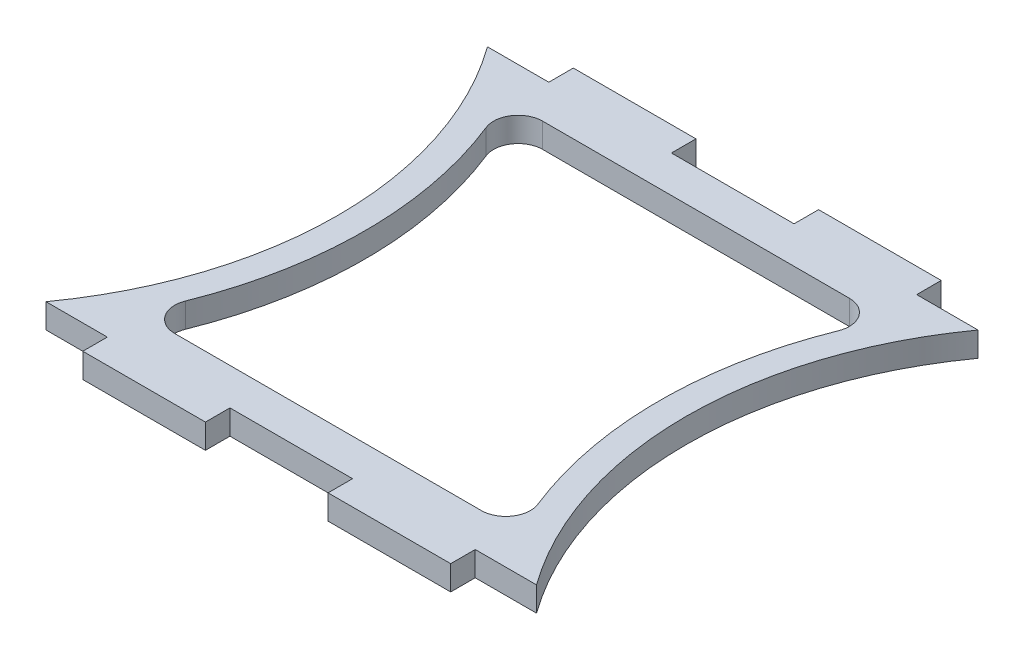
ISO-10303-21;
HEADER;
FILE_DESCRIPTION(('STEP AP214'),'2;1');
FILE_NAME('part.step','',(''),(''),'','','');
FILE_SCHEMA(('AUTOMOTIVE_DESIGN { 1 0 10303 214 1 1 1 1 }'));
ENDSEC;
DATA;
#1=APPLICATION_CONTEXT('core data for automotive mechanical design processes');
#2=APPLICATION_PROTOCOL_DEFINITION('international standard','automotive_design',2000,#1);
#3=PRODUCT_CONTEXT('',#1,'mechanical');
#4=PRODUCT('Part','Part','',(#3));
#5=PRODUCT_RELATED_PRODUCT_CATEGORY('part','',(#4));
#6=PRODUCT_DEFINITION_FORMATION('','',#4);
#7=PRODUCT_DEFINITION_CONTEXT('part definition',#1,'design');
#8=PRODUCT_DEFINITION('design','',#6,#7);
#9=PRODUCT_DEFINITION_SHAPE('','',#8);
#10=(LENGTH_UNIT() NAMED_UNIT(*) SI_UNIT(.MILLI.,.METRE.));
#11=(NAMED_UNIT(*) PLANE_ANGLE_UNIT() SI_UNIT($,.RADIAN.));
#12=(NAMED_UNIT(*) SI_UNIT($,.STERADIAN.) SOLID_ANGLE_UNIT());
#13=UNCERTAINTY_MEASURE_WITH_UNIT(LENGTH_MEASURE(1.E-05),#10,'distance_accuracy_value','');
#14=(GEOMETRIC_REPRESENTATION_CONTEXT(3) GLOBAL_UNCERTAINTY_ASSIGNED_CONTEXT((#13)) GLOBAL_UNIT_ASSIGNED_CONTEXT((#10,
#11,#12)) REPRESENTATION_CONTEXT('',''));
#15=CARTESIAN_POINT('',(0.,0.,0.));
#16=DIRECTION('',(0.,0.,1.));
#17=DIRECTION('',(1.,0.,0.));
#18=AXIS2_PLACEMENT_3D('',#15,#16,#17);
#19=CARTESIAN_POINT('',(45.,2.,0.));
#20=DIRECTION('',(0.,1.,0.));
#21=DIRECTION('',(0.,0.,1.));
#22=AXIS2_PLACEMENT_3D('',#19,#20,#21);
#23=PLANE('',#22);
#24=CARTESIAN_POINT('',(45.,2.,0.));
#25=DIRECTION('',(0.,-1.,0.));
#26=DIRECTION('',(0.,0.,1.));
#27=AXIS2_PLACEMENT_3D('',#24,#25,#26);
#28=CIRCLE('',#27,30.8058436014987);
#29=CARTESIAN_POINT('',(20.,2.,18.));
#30=VERTEX_POINT('',#29);
#31=CARTESIAN_POINT('',(20.,2.,-18.));
#32=VERTEX_POINT('',#31);
#33=EDGE_CURVE('E284',#30,#32,#28,.T.);
#34=ORIENTED_EDGE('',*,*,#33,.T.);
#35=DIRECTION('',(-1.,0.,0.));
#36=VECTOR('',#35,1.);
#37=CARTESIAN_POINT('',(15.,2.,-18.));
#38=LINE('',#37,#36);
#39=CARTESIAN_POINT('',(15.,2.,-18.));
#40=VERTEX_POINT('',#39);
#41=EDGE_CURVE('E287',#32,#40,#38,.T.);
#42=ORIENTED_EDGE('',*,*,#41,.T.);
#43=DIRECTION('',(0.,0.,-1.));
#44=VECTOR('',#43,1.);
#45=CARTESIAN_POINT('',(15.,2.,-18.));
#46=LINE('',#45,#44);
#47=CARTESIAN_POINT('',(15.,2.,-20.));
#48=VERTEX_POINT('',#47);
#49=EDGE_CURVE('E290',#40,#48,#46,.T.);
#50=ORIENTED_EDGE('',*,*,#49,.T.);
#51=DIRECTION('',(-1.,0.,0.));
#52=VECTOR('',#51,1.);
#53=CARTESIAN_POINT('',(15.,2.,-20.));
#54=LINE('',#53,#52);
#55=CARTESIAN_POINT('',(5.,2.,-20.));
#56=VERTEX_POINT('',#55);
#57=EDGE_CURVE('E292',#48,#56,#54,.T.);
#58=ORIENTED_EDGE('',*,*,#57,.T.);
#59=DIRECTION('',(0.,0.,1.));
#60=VECTOR('',#59,1.);
#61=CARTESIAN_POINT('',(5.,2.,-20.));
#62=LINE('',#61,#60);
#63=CARTESIAN_POINT('',(5.,2.,-18.));
#64=VERTEX_POINT('',#63);
#65=EDGE_CURVE('E294',#56,#64,#62,.T.);
#66=ORIENTED_EDGE('',*,*,#65,.T.);
#67=DIRECTION('',(-1.,0.,0.));
#68=VECTOR('',#67,1.);
#69=CARTESIAN_POINT('',(-5.,2.,-18.));
#70=LINE('',#69,#68);
#71=CARTESIAN_POINT('',(-5.,2.,-18.));
#72=VERTEX_POINT('',#71);
#73=EDGE_CURVE('E296',#64,#72,#70,.T.);
#74=ORIENTED_EDGE('',*,*,#73,.T.);
#75=DIRECTION('',(0.,0.,-1.));
#76=VECTOR('',#75,1.);
#77=CARTESIAN_POINT('',(-5.,2.,-20.));
#78=LINE('',#77,#76);
#79=CARTESIAN_POINT('',(-5.,2.,-20.));
#80=VERTEX_POINT('',#79);
#81=EDGE_CURVE('E298',#72,#80,#78,.T.);
#82=ORIENTED_EDGE('',*,*,#81,.T.);
#83=DIRECTION('',(-1.,0.,0.));
#84=VECTOR('',#83,1.);
#85=CARTESIAN_POINT('',(-15.,2.,-20.));
#86=LINE('',#85,#84);
#87=CARTESIAN_POINT('',(-15.,2.,-20.));
#88=VERTEX_POINT('',#87);
#89=EDGE_CURVE('E300',#80,#88,#86,.T.);
#90=ORIENTED_EDGE('',*,*,#89,.T.);
#91=DIRECTION('',(0.,0.,1.));
#92=VECTOR('',#91,1.);
#93=CARTESIAN_POINT('',(-15.,2.,-18.));
#94=LINE('',#93,#92);
#95=CARTESIAN_POINT('',(-15.,2.,-18.));
#96=VERTEX_POINT('',#95);
#97=EDGE_CURVE('E302',#88,#96,#94,.T.);
#98=ORIENTED_EDGE('',*,*,#97,.T.);
#99=DIRECTION('',(-1.,0.,0.));
#100=VECTOR('',#99,1.);
#101=CARTESIAN_POINT('',(-20.,2.,-18.));
#102=LINE('',#101,#100);
#103=CARTESIAN_POINT('',(-20.,2.,-18.));
#104=VERTEX_POINT('',#103);
#105=EDGE_CURVE('E304',#96,#104,#102,.T.);
#106=ORIENTED_EDGE('',*,*,#105,.T.);
#107=CARTESIAN_POINT('',(-45.,2.,0.));
#108=DIRECTION('',(0.,-1.,0.));
#109=DIRECTION('',(0.,0.,-1.));
#110=AXIS2_PLACEMENT_3D('',#107,#108,#109);
#111=CIRCLE('',#110,30.8058436014987);
#112=CARTESIAN_POINT('',(-20.,2.,18.));
#113=VERTEX_POINT('',#112);
#114=EDGE_CURVE('E306',#104,#113,#111,.T.);
#115=ORIENTED_EDGE('',*,*,#114,.T.);
#116=DIRECTION('',(1.,0.,0.));
#117=VECTOR('',#116,1.);
#118=CARTESIAN_POINT('',(-20.,2.,18.));
#119=LINE('',#118,#117);
#120=CARTESIAN_POINT('',(-15.,2.,18.));
#121=VERTEX_POINT('',#120);
#122=EDGE_CURVE('E308',#113,#121,#119,.T.);
#123=ORIENTED_EDGE('',*,*,#122,.T.);
#124=DIRECTION('',(0.,0.,1.));
#125=VECTOR('',#124,1.);
#126=CARTESIAN_POINT('',(-15.,2.,18.));
#127=LINE('',#126,#125);
#128=CARTESIAN_POINT('',(-15.,2.,20.));
#129=VERTEX_POINT('',#128);
#130=EDGE_CURVE('E310',#121,#129,#127,.T.);
#131=ORIENTED_EDGE('',*,*,#130,.T.);
#132=DIRECTION('',(1.,0.,0.));
#133=VECTOR('',#132,1.);
#134=CARTESIAN_POINT('',(-15.,2.,20.));
#135=LINE('',#134,#133);
#136=CARTESIAN_POINT('',(-5.,2.,20.));
#137=VERTEX_POINT('',#136);
#138=EDGE_CURVE('E312',#129,#137,#135,.T.);
#139=ORIENTED_EDGE('',*,*,#138,.T.);
#140=DIRECTION('',(0.,0.,-1.));
#141=VECTOR('',#140,1.);
#142=CARTESIAN_POINT('',(-5.,2.,20.));
#143=LINE('',#142,#141);
#144=CARTESIAN_POINT('',(-5.,2.,18.));
#145=VERTEX_POINT('',#144);
#146=EDGE_CURVE('E314',#137,#145,#143,.T.);
#147=ORIENTED_EDGE('',*,*,#146,.T.);
#148=DIRECTION('',(1.,0.,0.));
#149=VECTOR('',#148,1.);
#150=CARTESIAN_POINT('',(-5.,2.,18.));
#151=LINE('',#150,#149);
#152=CARTESIAN_POINT('',(5.,2.,18.));
#153=VERTEX_POINT('',#152);
#154=EDGE_CURVE('E316',#145,#153,#151,.T.);
#155=ORIENTED_EDGE('',*,*,#154,.T.);
#156=DIRECTION('',(0.,0.,1.));
#157=VECTOR('',#156,1.);
#158=CARTESIAN_POINT('',(5.,2.,20.));
#159=LINE('',#158,#157);
#160=CARTESIAN_POINT('',(5.,2.,20.));
#161=VERTEX_POINT('',#160);
#162=EDGE_CURVE('E318',#153,#161,#159,.T.);
#163=ORIENTED_EDGE('',*,*,#162,.T.);
#164=DIRECTION('',(1.,0.,0.));
#165=VECTOR('',#164,1.);
#166=CARTESIAN_POINT('',(15.,2.,20.));
#167=LINE('',#166,#165);
#168=CARTESIAN_POINT('',(15.,2.,20.));
#169=VERTEX_POINT('',#168);
#170=EDGE_CURVE('E320',#161,#169,#167,.T.);
#171=ORIENTED_EDGE('',*,*,#170,.T.);
#172=DIRECTION('',(0.,0.,-1.));
#173=VECTOR('',#172,1.);
#174=CARTESIAN_POINT('',(15.,2.,18.));
#175=LINE('',#174,#173);
#176=CARTESIAN_POINT('',(15.,2.,18.));
#177=VERTEX_POINT('',#176);
#178=EDGE_CURVE('E322',#169,#177,#175,.T.);
#179=ORIENTED_EDGE('',*,*,#178,.T.);
#180=DIRECTION('',(1.,0.,0.));
#181=VECTOR('',#180,1.);
#182=CARTESIAN_POINT('',(15.,2.,18.));
#183=LINE('',#182,#181);
#184=EDGE_CURVE('E324',#177,#30,#183,.T.);
#185=ORIENTED_EDGE('',*,*,#184,.T.);
#186=EDGE_LOOP('',(#34,#42,#50,#58,#66,#74,#82,#90,#98,#106,#115,#123,#131,#139,#147,#155,#163,
#171,#179,#185));
#187=FACE_BOUND('',#186,.T.);
#188=DIRECTION('',(1.,0.,0.));
#189=VECTOR('',#188,1.);
#190=CARTESIAN_POINT('',(-12.5038463814561,2.,15.));
#191=LINE('',#190,#189);
#192=CARTESIAN_POINT('',(-12.5038463814561,2.,15.));
#193=VERTEX_POINT('',#192);
#194=CARTESIAN_POINT('',(12.5038463814561,2.,15.));
#195=VERTEX_POINT('',#194);
#196=EDGE_CURVE('E227',#193,#195,#191,.T.);
#197=ORIENTED_EDGE('',*,*,#196,.F.);
#198=CARTESIAN_POINT('',(-12.5038463814561,2.,13.));
#199=DIRECTION('',(0.,1.,0.));
#200=DIRECTION('',(0.,0.,-1.));
#201=AXIS2_PLACEMENT_3D('',#198,#199,#200);
#202=CIRCLE('',#201,2.);
#203=CARTESIAN_POINT('',(-14.3607694453729,2.,12.2571428571429));
#204=VERTEX_POINT('',#203);
#205=EDGE_CURVE('E219',#204,#193,#202,.T.);
#206=ORIENTED_EDGE('',*,*,#205,.F.);
#207=CARTESIAN_POINT('',(-45.,2.,0.));
#208=DIRECTION('',(0.,-1.,0.));
#209=DIRECTION('',(0.,0.,-1.));
#210=AXIS2_PLACEMENT_3D('',#207,#208,#209);
#211=CIRCLE('',#210,33.);
#212=CARTESIAN_POINT('',(-14.3607694453729,2.,-12.2571428571429));
#213=VERTEX_POINT('',#212);
#214=EDGE_CURVE('E252',#213,#204,#211,.T.);
#215=ORIENTED_EDGE('',*,*,#214,.F.);
#216=CARTESIAN_POINT('',(-12.5038463814562,2.,-13.));
#217=DIRECTION('',(0.,1.,0.));
#218=DIRECTION('',(0.,0.,-1.));
#219=AXIS2_PLACEMENT_3D('',#216,#217,#218);
#220=CIRCLE('',#219,2.);
#221=CARTESIAN_POINT('',(-12.5038463814562,2.,-15.));
#222=VERTEX_POINT('',#221);
#223=EDGE_CURVE('E250',#222,#213,#220,.T.);
#224=ORIENTED_EDGE('',*,*,#223,.F.);
#225=DIRECTION('',(-1.,0.,0.));
#226=VECTOR('',#225,1.);
#227=CARTESIAN_POINT('',(-12.5038463814562,2.,-15.));
#228=LINE('',#227,#226);
#229=CARTESIAN_POINT('',(12.5038463814562,2.,-15.));
#230=VERTEX_POINT('',#229);
#231=EDGE_CURVE('E248',#230,#222,#228,.T.);
#232=ORIENTED_EDGE('',*,*,#231,.F.);
#233=CARTESIAN_POINT('',(12.5038463814562,2.,-13.));
#234=DIRECTION('',(0.,1.,0.));
#235=DIRECTION('',(0.,0.,-1.));
#236=AXIS2_PLACEMENT_3D('',#233,#234,#235);
#237=CIRCLE('',#236,2.);
#238=CARTESIAN_POINT('',(14.3607694453729,2.,-12.2571428571429));
#239=VERTEX_POINT('',#238);
#240=EDGE_CURVE('E246',#239,#230,#237,.T.);
#241=ORIENTED_EDGE('',*,*,#240,.F.);
#242=CARTESIAN_POINT('',(45.,2.,0.));
#243=DIRECTION('',(0.,-1.,0.));
#244=DIRECTION('',(0.,0.,1.));
#245=AXIS2_PLACEMENT_3D('',#242,#243,#244);
#246=CIRCLE('',#245,33.);
#247=CARTESIAN_POINT('',(14.3607694453729,2.,12.2571428571429));
#248=VERTEX_POINT('',#247);
#249=EDGE_CURVE('E242',#248,#239,#246,.T.);
#250=ORIENTED_EDGE('',*,*,#249,.F.);
#251=CARTESIAN_POINT('',(12.5038463814561,2.,13.));
#252=DIRECTION('',(0.,1.,0.));
#253=DIRECTION('',(0.,0.,-1.));
#254=AXIS2_PLACEMENT_3D('',#251,#252,#253);
#255=CIRCLE('',#254,2.);
#256=EDGE_CURVE('E240',#195,#248,#255,.T.);
#257=ORIENTED_EDGE('',*,*,#256,.F.);
#258=EDGE_LOOP('',(#197,#206,#215,#224,#232,#241,#250,#257));
#259=FACE_BOUND('',#258,.T.);
#260=ADVANCED_FACE('F34',(#187,#259),#23,.T.);
#261=CARTESIAN_POINT('',(45.,0.,0.));
#262=DIRECTION('',(0.,1.,0.));
#263=DIRECTION('',(0.,0.,1.));
#264=AXIS2_PLACEMENT_3D('',#261,#262,#263);
#265=PLANE('',#264);
#266=CARTESIAN_POINT('',(45.,0.,0.));
#267=DIRECTION('',(0.,-1.,0.));
#268=DIRECTION('',(0.,0.,1.));
#269=AXIS2_PLACEMENT_3D('',#266,#267,#268);
#270=CIRCLE('',#269,30.8058436014987);
#271=CARTESIAN_POINT('',(20.,0.,18.));
#272=VERTEX_POINT('',#271);
#273=CARTESIAN_POINT('',(20.,0.,-18.));
#274=VERTEX_POINT('',#273);
#275=EDGE_CURVE('E235',#272,#274,#270,.T.);
#276=ORIENTED_EDGE('',*,*,#275,.F.);
#277=DIRECTION('',(1.,0.,0.));
#278=VECTOR('',#277,1.);
#279=CARTESIAN_POINT('',(15.,0.,18.));
#280=LINE('',#279,#278);
#281=CARTESIAN_POINT('',(15.,0.,18.));
#282=VERTEX_POINT('',#281);
#283=EDGE_CURVE('E288',#282,#272,#280,.T.);
#284=ORIENTED_EDGE('',*,*,#283,.F.);
#285=DIRECTION('',(0.,0.,-1.));
#286=VECTOR('',#285,1.);
#287=CARTESIAN_POINT('',(15.,0.,18.));
#288=LINE('',#287,#286);
#289=CARTESIAN_POINT('',(15.,0.,20.));
#290=VERTEX_POINT('',#289);
#291=EDGE_CURVE('E363',#290,#282,#288,.T.);
#292=ORIENTED_EDGE('',*,*,#291,.F.);
#293=DIRECTION('',(1.,0.,0.));
#294=VECTOR('',#293,1.);
#295=CARTESIAN_POINT('',(15.,0.,20.));
#296=LINE('',#295,#294);
#297=CARTESIAN_POINT('',(5.,0.,20.));
#298=VERTEX_POINT('',#297);
#299=EDGE_CURVE('E361',#298,#290,#296,.T.);
#300=ORIENTED_EDGE('',*,*,#299,.F.);
#301=DIRECTION('',(0.,0.,1.));
#302=VECTOR('',#301,1.);
#303=CARTESIAN_POINT('',(5.,0.,20.));
#304=LINE('',#303,#302);
#305=CARTESIAN_POINT('',(5.,0.,18.));
#306=VERTEX_POINT('',#305);
#307=EDGE_CURVE('E359',#306,#298,#304,.T.);
#308=ORIENTED_EDGE('',*,*,#307,.F.);
#309=DIRECTION('',(1.,0.,0.));
#310=VECTOR('',#309,1.);
#311=CARTESIAN_POINT('',(-5.,0.,18.));
#312=LINE('',#311,#310);
#313=CARTESIAN_POINT('',(-5.,0.,18.));
#314=VERTEX_POINT('',#313);
#315=EDGE_CURVE('E357',#314,#306,#312,.T.);
#316=ORIENTED_EDGE('',*,*,#315,.F.);
#317=DIRECTION('',(0.,0.,-1.));
#318=VECTOR('',#317,1.);
#319=CARTESIAN_POINT('',(-5.,0.,20.));
#320=LINE('',#319,#318);
#321=CARTESIAN_POINT('',(-5.,0.,20.));
#322=VERTEX_POINT('',#321);
#323=EDGE_CURVE('E355',#322,#314,#320,.T.);
#324=ORIENTED_EDGE('',*,*,#323,.F.);
#325=DIRECTION('',(1.,0.,0.));
#326=VECTOR('',#325,1.);
#327=CARTESIAN_POINT('',(-15.,0.,20.));
#328=LINE('',#327,#326);
#329=CARTESIAN_POINT('',(-15.,0.,20.));
#330=VERTEX_POINT('',#329);
#331=EDGE_CURVE('E353',#330,#322,#328,.T.);
#332=ORIENTED_EDGE('',*,*,#331,.F.);
#333=DIRECTION('',(0.,0.,1.));
#334=VECTOR('',#333,1.);
#335=CARTESIAN_POINT('',(-15.,0.,18.));
#336=LINE('',#335,#334);
#337=CARTESIAN_POINT('',(-15.,0.,18.));
#338=VERTEX_POINT('',#337);
#339=EDGE_CURVE('E351',#338,#330,#336,.T.);
#340=ORIENTED_EDGE('',*,*,#339,.F.);
#341=DIRECTION('',(1.,0.,0.));
#342=VECTOR('',#341,1.);
#343=CARTESIAN_POINT('',(-20.,0.,18.));
#344=LINE('',#343,#342);
#345=CARTESIAN_POINT('',(-20.,0.,18.));
#346=VERTEX_POINT('',#345);
#347=EDGE_CURVE('E349',#346,#338,#344,.T.);
#348=ORIENTED_EDGE('',*,*,#347,.F.);
#349=CARTESIAN_POINT('',(-45.,0.,0.));
#350=DIRECTION('',(0.,-1.,0.));
#351=DIRECTION('',(0.,0.,-1.));
#352=AXIS2_PLACEMENT_3D('',#349,#350,#351);
#353=CIRCLE('',#352,30.8058436014987);
#354=CARTESIAN_POINT('',(-20.,0.,-18.));
#355=VERTEX_POINT('',#354);
#356=EDGE_CURVE('E347',#355,#346,#353,.T.);
#357=ORIENTED_EDGE('',*,*,#356,.F.);
#358=DIRECTION('',(-1.,0.,0.));
#359=VECTOR('',#358,1.);
#360=CARTESIAN_POINT('',(-20.,0.,-18.));
#361=LINE('',#360,#359);
#362=CARTESIAN_POINT('',(-15.,0.,-18.));
#363=VERTEX_POINT('',#362);
#364=EDGE_CURVE('E345',#363,#355,#361,.T.);
#365=ORIENTED_EDGE('',*,*,#364,.F.);
#366=DIRECTION('',(0.,0.,1.));
#367=VECTOR('',#366,1.);
#368=CARTESIAN_POINT('',(-15.,0.,-18.));
#369=LINE('',#368,#367);
#370=CARTESIAN_POINT('',(-15.,0.,-20.));
#371=VERTEX_POINT('',#370);
#372=EDGE_CURVE('E343',#371,#363,#369,.T.);
#373=ORIENTED_EDGE('',*,*,#372,.F.);
#374=DIRECTION('',(-1.,0.,0.));
#375=VECTOR('',#374,1.);
#376=CARTESIAN_POINT('',(-15.,0.,-20.));
#377=LINE('',#376,#375);
#378=CARTESIAN_POINT('',(-5.,0.,-20.));
#379=VERTEX_POINT('',#378);
#380=EDGE_CURVE('E341',#379,#371,#377,.T.);
#381=ORIENTED_EDGE('',*,*,#380,.F.);
#382=DIRECTION('',(0.,0.,-1.));
#383=VECTOR('',#382,1.);
#384=CARTESIAN_POINT('',(-5.,0.,-20.));
#385=LINE('',#384,#383);
#386=CARTESIAN_POINT('',(-5.,0.,-18.));
#387=VERTEX_POINT('',#386);
#388=EDGE_CURVE('E339',#387,#379,#385,.T.);
#389=ORIENTED_EDGE('',*,*,#388,.F.);
#390=DIRECTION('',(-1.,0.,0.));
#391=VECTOR('',#390,1.);
#392=CARTESIAN_POINT('',(-5.,0.,-18.));
#393=LINE('',#392,#391);
#394=CARTESIAN_POINT('',(5.,0.,-18.));
#395=VERTEX_POINT('',#394);
#396=EDGE_CURVE('E337',#395,#387,#393,.T.);
#397=ORIENTED_EDGE('',*,*,#396,.F.);
#398=DIRECTION('',(0.,0.,1.));
#399=VECTOR('',#398,1.);
#400=CARTESIAN_POINT('',(5.,0.,-20.));
#401=LINE('',#400,#399);
#402=CARTESIAN_POINT('',(5.,0.,-20.));
#403=VERTEX_POINT('',#402);
#404=EDGE_CURVE('E335',#403,#395,#401,.T.);
#405=ORIENTED_EDGE('',*,*,#404,.F.);
#406=DIRECTION('',(-1.,0.,0.));
#407=VECTOR('',#406,1.);
#408=CARTESIAN_POINT('',(15.,0.,-20.));
#409=LINE('',#408,#407);
#410=CARTESIAN_POINT('',(15.,0.,-20.));
#411=VERTEX_POINT('',#410);
#412=EDGE_CURVE('E333',#411,#403,#409,.T.);
#413=ORIENTED_EDGE('',*,*,#412,.F.);
#414=DIRECTION('',(0.,0.,-1.));
#415=VECTOR('',#414,1.);
#416=CARTESIAN_POINT('',(15.,0.,-18.));
#417=LINE('',#416,#415);
#418=CARTESIAN_POINT('',(15.,0.,-18.));
#419=VERTEX_POINT('',#418);
#420=EDGE_CURVE('E331',#419,#411,#417,.T.);
#421=ORIENTED_EDGE('',*,*,#420,.F.);
#422=DIRECTION('',(-1.,0.,0.));
#423=VECTOR('',#422,1.);
#424=CARTESIAN_POINT('',(15.,0.,-18.));
#425=LINE('',#424,#423);
#426=EDGE_CURVE('E329',#274,#419,#425,.T.);
#427=ORIENTED_EDGE('',*,*,#426,.F.);
#428=EDGE_LOOP('',(#276,#284,#292,#300,#308,#316,#324,#332,#340,#348,#357,#365,#373,#381,#389,
#397,#405,#413,#421,#427));
#429=FACE_BOUND('',#428,.T.);
#430=CARTESIAN_POINT('',(-12.5038463814561,0.,13.));
#431=DIRECTION('',(0.,1.,0.));
#432=DIRECTION('',(0.,0.,-1.));
#433=AXIS2_PLACEMENT_3D('',#430,#431,#432);
#434=CIRCLE('',#433,2.);
#435=CARTESIAN_POINT('',(-14.3607694453729,0.,12.2571428571429));
#436=VERTEX_POINT('',#435);
#437=CARTESIAN_POINT('',(-12.5038463814561,0.,15.));
#438=VERTEX_POINT('',#437);
#439=EDGE_CURVE('E57',#436,#438,#434,.T.);
#440=ORIENTED_EDGE('',*,*,#439,.T.);
#441=DIRECTION('',(1.,0.,0.));
#442=VECTOR('',#441,1.);
#443=CARTESIAN_POINT('',(-12.5038463814561,0.,15.));
#444=LINE('',#443,#442);
#445=CARTESIAN_POINT('',(12.5038463814561,0.,15.));
#446=VERTEX_POINT('',#445);
#447=EDGE_CURVE('E234',#438,#446,#444,.T.);
#448=ORIENTED_EDGE('',*,*,#447,.T.);
#449=CARTESIAN_POINT('',(12.5038463814561,0.,13.));
#450=DIRECTION('',(0.,1.,0.));
#451=DIRECTION('',(0.,0.,-1.));
#452=AXIS2_PLACEMENT_3D('',#449,#450,#451);
#453=CIRCLE('',#452,2.);
#454=CARTESIAN_POINT('',(14.3607694453729,0.,12.2571428571429));
#455=VERTEX_POINT('',#454);
#456=EDGE_CURVE('E256',#446,#455,#453,.T.);
#457=ORIENTED_EDGE('',*,*,#456,.T.);
#458=CARTESIAN_POINT('',(45.,0.,0.));
#459=DIRECTION('',(0.,-1.,0.));
#460=DIRECTION('',(0.,0.,1.));
#461=AXIS2_PLACEMENT_3D('',#458,#459,#460);
#462=CIRCLE('',#461,33.);
#463=CARTESIAN_POINT('',(14.3607694453729,0.,-12.2571428571429));
#464=VERTEX_POINT('',#463);
#465=EDGE_CURVE('E259',#455,#464,#462,.T.);
#466=ORIENTED_EDGE('',*,*,#465,.T.);
#467=CARTESIAN_POINT('',(12.5038463814562,0.,-13.));
#468=DIRECTION('',(0.,1.,0.));
#469=DIRECTION('',(0.,0.,-1.));
#470=AXIS2_PLACEMENT_3D('',#467,#468,#469);
#471=CIRCLE('',#470,2.);
#472=CARTESIAN_POINT('',(12.5038463814562,0.,-15.));
#473=VERTEX_POINT('',#472);
#474=EDGE_CURVE('E262',#464,#473,#471,.T.);
#475=ORIENTED_EDGE('',*,*,#474,.T.);
#476=DIRECTION('',(-1.,0.,0.));
#477=VECTOR('',#476,1.);
#478=CARTESIAN_POINT('',(-12.5038463814562,0.,-15.));
#479=LINE('',#478,#477);
#480=CARTESIAN_POINT('',(-12.5038463814562,0.,-15.));
#481=VERTEX_POINT('',#480);
#482=EDGE_CURVE('E265',#473,#481,#479,.T.);
#483=ORIENTED_EDGE('',*,*,#482,.T.);
#484=CARTESIAN_POINT('',(-12.5038463814562,0.,-13.));
#485=DIRECTION('',(0.,1.,0.));
#486=DIRECTION('',(0.,0.,-1.));
#487=AXIS2_PLACEMENT_3D('',#484,#485,#486);
#488=CIRCLE('',#487,2.);
#489=CARTESIAN_POINT('',(-14.3607694453729,0.,-12.2571428571429));
#490=VERTEX_POINT('',#489);
#491=EDGE_CURVE('E268',#481,#490,#488,.T.);
#492=ORIENTED_EDGE('',*,*,#491,.T.);
#493=CARTESIAN_POINT('',(-45.,0.,0.));
#494=DIRECTION('',(0.,-1.,0.));
#495=DIRECTION('',(0.,0.,-1.));
#496=AXIS2_PLACEMENT_3D('',#493,#494,#495);
#497=CIRCLE('',#496,33.);
#498=EDGE_CURVE('E228',#490,#436,#497,.T.);
#499=ORIENTED_EDGE('',*,*,#498,.T.);
#500=EDGE_LOOP('',(#440,#448,#457,#466,#475,#483,#492,#499));
#501=FACE_BOUND('',#500,.T.);
#502=ADVANCED_FACE('F429',(#429,#501),#265,.F.);
#503=CARTESIAN_POINT('',(45.,2.,0.));
#504=DIRECTION('',(0.,-1.,0.));
#505=DIRECTION('',(0.,0.,-1.));
#506=AXIS2_PLACEMENT_3D('',#503,#504,#505);
#507=CYLINDRICAL_SURFACE('',#506,30.8058436014987);
#508=ORIENTED_EDGE('',*,*,#275,.T.);
#509=DIRECTION('',(0.,-1.,0.));
#510=VECTOR('',#509,1.);
#511=CARTESIAN_POINT('',(20.,2.,-18.));
#512=LINE('',#511,#510);
#513=EDGE_CURVE('E11',#32,#274,#512,.T.);
#514=ORIENTED_EDGE('',*,*,#513,.F.);
#515=ORIENTED_EDGE('',*,*,#33,.F.);
#516=DIRECTION('',(0.,-1.,0.));
#517=VECTOR('',#516,1.);
#518=CARTESIAN_POINT('',(20.,2.,18.));
#519=LINE('',#518,#517);
#520=EDGE_CURVE('E326',#30,#272,#519,.T.);
#521=ORIENTED_EDGE('',*,*,#520,.T.);
#522=EDGE_LOOP('',(#508,#514,#515,#521));
#523=FACE_BOUND('',#522,.T.);
#524=ADVANCED_FACE('F36',(#523),#507,.F.);
#525=CARTESIAN_POINT('',(15.,2.,-18.));
#526=DIRECTION('',(0.,0.,1.));
#527=DIRECTION('',(1.,0.,0.));
#528=AXIS2_PLACEMENT_3D('',#525,#526,#527);
#529=PLANE('',#528);
#530=ORIENTED_EDGE('',*,*,#426,.T.);
#531=DIRECTION('',(0.,-1.,0.));
#532=VECTOR('',#531,1.);
#533=CARTESIAN_POINT('',(15.,2.,-18.));
#534=LINE('',#533,#532);
#535=EDGE_CURVE('E42',#40,#419,#534,.T.);
#536=ORIENTED_EDGE('',*,*,#535,.F.);
#537=ORIENTED_EDGE('',*,*,#41,.F.);
#538=ORIENTED_EDGE('',*,*,#513,.T.);
#539=EDGE_LOOP('',(#530,#536,#537,#538));
#540=FACE_BOUND('',#539,.T.);
#541=ADVANCED_FACE('F446',(#540),#529,.F.);
#542=CARTESIAN_POINT('',(15.,2.,-18.));
#543=DIRECTION('',(-1.,0.,0.));
#544=DIRECTION('',(0.,0.,1.));
#545=AXIS2_PLACEMENT_3D('',#542,#543,#544);
#546=PLANE('',#545);
#547=ORIENTED_EDGE('',*,*,#420,.T.);
#548=DIRECTION('',(0.,-1.,0.));
#549=VECTOR('',#548,1.);
#550=CARTESIAN_POINT('',(15.,2.,-20.));
#551=LINE('',#550,#549);
#552=EDGE_CURVE('E416',#48,#411,#551,.T.);
#553=ORIENTED_EDGE('',*,*,#552,.F.);
#554=ORIENTED_EDGE('',*,*,#49,.F.);
#555=ORIENTED_EDGE('',*,*,#535,.T.);
#556=EDGE_LOOP('',(#547,#553,#554,#555));
#557=FACE_BOUND('',#556,.T.);
#558=ADVANCED_FACE('F423',(#557),#546,.F.);
#559=CARTESIAN_POINT('',(15.,2.,-20.));
#560=DIRECTION('',(0.,0.,1.));
#561=DIRECTION('',(1.,0.,0.));
#562=AXIS2_PLACEMENT_3D('',#559,#560,#561);
#563=PLANE('',#562);
#564=ORIENTED_EDGE('',*,*,#412,.T.);
#565=DIRECTION('',(0.,-1.,0.));
#566=VECTOR('',#565,1.);
#567=CARTESIAN_POINT('',(5.,2.,-20.));
#568=LINE('',#567,#566);
#569=EDGE_CURVE('E413',#56,#403,#568,.T.);
#570=ORIENTED_EDGE('',*,*,#569,.F.);
#571=ORIENTED_EDGE('',*,*,#57,.F.);
#572=ORIENTED_EDGE('',*,*,#552,.T.);
#573=EDGE_LOOP('',(#564,#570,#571,#572));
#574=FACE_BOUND('',#573,.T.);
#575=ADVANCED_FACE('F435',(#574),#563,.F.);
#576=CARTESIAN_POINT('',(5.,2.,-20.));
#577=DIRECTION('',(1.,0.,0.));
#578=DIRECTION('',(0.,0.,-1.));
#579=AXIS2_PLACEMENT_3D('',#576,#577,#578);
#580=PLANE('',#579);
#581=ORIENTED_EDGE('',*,*,#404,.T.);
#582=DIRECTION('',(0.,-1.,0.));
#583=VECTOR('',#582,1.);
#584=CARTESIAN_POINT('',(5.,2.,-18.));
#585=LINE('',#584,#583);
#586=EDGE_CURVE('E410',#64,#395,#585,.T.);
#587=ORIENTED_EDGE('',*,*,#586,.F.);
#588=ORIENTED_EDGE('',*,*,#65,.F.);
#589=ORIENTED_EDGE('',*,*,#569,.T.);
#590=EDGE_LOOP('',(#581,#587,#588,#589));
#591=FACE_BOUND('',#590,.T.);
#592=ADVANCED_FACE('F439',(#591),#580,.F.);
#593=CARTESIAN_POINT('',(-5.,2.,-18.));
#594=DIRECTION('',(0.,0.,1.));
#595=DIRECTION('',(1.,0.,0.));
#596=AXIS2_PLACEMENT_3D('',#593,#594,#595);
#597=PLANE('',#596);
#598=ORIENTED_EDGE('',*,*,#396,.T.);
#599=DIRECTION('',(0.,-1.,0.));
#600=VECTOR('',#599,1.);
#601=CARTESIAN_POINT('',(-5.,2.,-18.));
#602=LINE('',#601,#600);
#603=EDGE_CURVE('E407',#72,#387,#602,.T.);
#604=ORIENTED_EDGE('',*,*,#603,.F.);
#605=ORIENTED_EDGE('',*,*,#73,.F.);
#606=ORIENTED_EDGE('',*,*,#586,.T.);
#607=EDGE_LOOP('',(#598,#604,#605,#606));
#608=FACE_BOUND('',#607,.T.);
#609=ADVANCED_FACE('F519',(#608),#597,.F.);
#610=CARTESIAN_POINT('',(-5.,2.,-20.));
#611=DIRECTION('',(-1.,0.,0.));
#612=DIRECTION('',(0.,0.,1.));
#613=AXIS2_PLACEMENT_3D('',#610,#611,#612);
#614=PLANE('',#613);
#615=ORIENTED_EDGE('',*,*,#388,.T.);
#616=DIRECTION('',(0.,-1.,0.));
#617=VECTOR('',#616,1.);
#618=CARTESIAN_POINT('',(-5.,2.,-20.));
#619=LINE('',#618,#617);
#620=EDGE_CURVE('E404',#80,#379,#619,.T.);
#621=ORIENTED_EDGE('',*,*,#620,.F.);
#622=ORIENTED_EDGE('',*,*,#81,.F.);
#623=ORIENTED_EDGE('',*,*,#603,.T.);
#624=EDGE_LOOP('',(#615,#621,#622,#623));
#625=FACE_BOUND('',#624,.T.);
#626=ADVANCED_FACE('F517',(#625),#614,.F.);
#627=CARTESIAN_POINT('',(-15.,2.,-20.));
#628=DIRECTION('',(0.,0.,1.));
#629=DIRECTION('',(1.,0.,0.));
#630=AXIS2_PLACEMENT_3D('',#627,#628,#629);
#631=PLANE('',#630);
#632=ORIENTED_EDGE('',*,*,#380,.T.);
#633=DIRECTION('',(0.,-1.,0.));
#634=VECTOR('',#633,1.);
#635=CARTESIAN_POINT('',(-15.,2.,-20.));
#636=LINE('',#635,#634);
#637=EDGE_CURVE('E401',#88,#371,#636,.T.);
#638=ORIENTED_EDGE('',*,*,#637,.F.);
#639=ORIENTED_EDGE('',*,*,#89,.F.);
#640=ORIENTED_EDGE('',*,*,#620,.T.);
#641=EDGE_LOOP('',(#632,#638,#639,#640));
#642=FACE_BOUND('',#641,.T.);
#643=ADVANCED_FACE('F512',(#642),#631,.F.);
#644=CARTESIAN_POINT('',(-15.,2.,-18.));
#645=DIRECTION('',(1.,0.,0.));
#646=DIRECTION('',(0.,0.,-1.));
#647=AXIS2_PLACEMENT_3D('',#644,#645,#646);
#648=PLANE('',#647);
#649=ORIENTED_EDGE('',*,*,#372,.T.);
#650=DIRECTION('',(0.,-1.,0.));
#651=VECTOR('',#650,1.);
#652=CARTESIAN_POINT('',(-15.,2.,-18.));
#653=LINE('',#652,#651);
#654=EDGE_CURVE('E398',#96,#363,#653,.T.);
#655=ORIENTED_EDGE('',*,*,#654,.F.);
#656=ORIENTED_EDGE('',*,*,#97,.F.);
#657=ORIENTED_EDGE('',*,*,#637,.T.);
#658=EDGE_LOOP('',(#649,#655,#656,#657));
#659=FACE_BOUND('',#658,.T.);
#660=ADVANCED_FACE('F507',(#659),#648,.F.);
#661=CARTESIAN_POINT('',(-20.,2.,-18.));
#662=DIRECTION('',(0.,0.,1.));
#663=DIRECTION('',(1.,0.,0.));
#664=AXIS2_PLACEMENT_3D('',#661,#662,#663);
#665=PLANE('',#664);
#666=ORIENTED_EDGE('',*,*,#364,.T.);
#667=DIRECTION('',(0.,-1.,0.));
#668=VECTOR('',#667,1.);
#669=CARTESIAN_POINT('',(-20.,2.,-18.));
#670=LINE('',#669,#668);
#671=EDGE_CURVE('E395',#104,#355,#670,.T.);
#672=ORIENTED_EDGE('',*,*,#671,.F.);
#673=ORIENTED_EDGE('',*,*,#105,.F.);
#674=ORIENTED_EDGE('',*,*,#654,.T.);
#675=EDGE_LOOP('',(#666,#672,#673,#674));
#676=FACE_BOUND('',#675,.T.);
#677=ADVANCED_FACE('F503',(#676),#665,.F.);
#678=CARTESIAN_POINT('',(-45.,2.,0.));
#679=DIRECTION('',(0.,-1.,0.));
#680=DIRECTION('',(0.,0.,-1.));
#681=AXIS2_PLACEMENT_3D('',#678,#679,#680);
#682=CYLINDRICAL_SURFACE('',#681,30.8058436014987);
#683=ORIENTED_EDGE('',*,*,#356,.T.);
#684=DIRECTION('',(0.,-1.,0.));
#685=VECTOR('',#684,1.);
#686=CARTESIAN_POINT('',(-20.,2.,18.));
#687=LINE('',#686,#685);
#688=EDGE_CURVE('E392',#113,#346,#687,.T.);
#689=ORIENTED_EDGE('',*,*,#688,.F.);
#690=ORIENTED_EDGE('',*,*,#114,.F.);
#691=ORIENTED_EDGE('',*,*,#671,.T.);
#692=EDGE_LOOP('',(#683,#689,#690,#691));
#693=FACE_BOUND('',#692,.T.);
#694=ADVANCED_FACE('F498',(#693),#682,.F.);
#695=CARTESIAN_POINT('',(-20.,2.,18.));
#696=DIRECTION('',(0.,0.,-1.));
#697=DIRECTION('',(-1.,0.,0.));
#698=AXIS2_PLACEMENT_3D('',#695,#696,#697);
#699=PLANE('',#698);
#700=ORIENTED_EDGE('',*,*,#347,.T.);
#701=DIRECTION('',(0.,-1.,0.));
#702=VECTOR('',#701,1.);
#703=CARTESIAN_POINT('',(-15.,2.,18.));
#704=LINE('',#703,#702);
#705=EDGE_CURVE('E389',#121,#338,#704,.T.);
#706=ORIENTED_EDGE('',*,*,#705,.F.);
#707=ORIENTED_EDGE('',*,*,#122,.F.);
#708=ORIENTED_EDGE('',*,*,#688,.T.);
#709=EDGE_LOOP('',(#700,#706,#707,#708));
#710=FACE_BOUND('',#709,.T.);
#711=ADVANCED_FACE('F492',(#710),#699,.F.);
#712=CARTESIAN_POINT('',(-15.,2.,18.));
#713=DIRECTION('',(1.,0.,0.));
#714=DIRECTION('',(0.,0.,-1.));
#715=AXIS2_PLACEMENT_3D('',#712,#713,#714);
#716=PLANE('',#715);
#717=ORIENTED_EDGE('',*,*,#339,.T.);
#718=DIRECTION('',(0.,-1.,0.));
#719=VECTOR('',#718,1.);
#720=CARTESIAN_POINT('',(-15.,2.,20.));
#721=LINE('',#720,#719);
#722=EDGE_CURVE('E386',#129,#330,#721,.T.);
#723=ORIENTED_EDGE('',*,*,#722,.F.);
#724=ORIENTED_EDGE('',*,*,#130,.F.);
#725=ORIENTED_EDGE('',*,*,#705,.T.);
#726=EDGE_LOOP('',(#717,#723,#724,#725));
#727=FACE_BOUND('',#726,.T.);
#728=ADVANCED_FACE('F488',(#727),#716,.F.);
#729=CARTESIAN_POINT('',(-15.,2.,20.));
#730=DIRECTION('',(0.,0.,-1.));
#731=DIRECTION('',(-1.,0.,0.));
#732=AXIS2_PLACEMENT_3D('',#729,#730,#731);
#733=PLANE('',#732);
#734=ORIENTED_EDGE('',*,*,#331,.T.);
#735=DIRECTION('',(0.,-1.,0.));
#736=VECTOR('',#735,1.);
#737=CARTESIAN_POINT('',(-5.,2.,20.));
#738=LINE('',#737,#736);
#739=EDGE_CURVE('E383',#137,#322,#738,.T.);
#740=ORIENTED_EDGE('',*,*,#739,.F.);
#741=ORIENTED_EDGE('',*,*,#138,.F.);
#742=ORIENTED_EDGE('',*,*,#722,.T.);
#743=EDGE_LOOP('',(#734,#740,#741,#742));
#744=FACE_BOUND('',#743,.T.);
#745=ADVANCED_FACE('F483',(#744),#733,.F.);
#746=CARTESIAN_POINT('',(-5.,2.,20.));
#747=DIRECTION('',(-1.,0.,0.));
#748=DIRECTION('',(0.,0.,1.));
#749=AXIS2_PLACEMENT_3D('',#746,#747,#748);
#750=PLANE('',#749);
#751=ORIENTED_EDGE('',*,*,#323,.T.);
#752=DIRECTION('',(0.,-1.,0.));
#753=VECTOR('',#752,1.);
#754=CARTESIAN_POINT('',(-5.,2.,18.));
#755=LINE('',#754,#753);
#756=EDGE_CURVE('E380',#145,#314,#755,.T.);
#757=ORIENTED_EDGE('',*,*,#756,.F.);
#758=ORIENTED_EDGE('',*,*,#146,.F.);
#759=ORIENTED_EDGE('',*,*,#739,.T.);
#760=EDGE_LOOP('',(#751,#757,#758,#759));
#761=FACE_BOUND('',#760,.T.);
#762=ADVANCED_FACE('F477',(#761),#750,.F.);
#763=CARTESIAN_POINT('',(-5.,2.,18.));
#764=DIRECTION('',(0.,0.,-1.));
#765=DIRECTION('',(-1.,0.,0.));
#766=AXIS2_PLACEMENT_3D('',#763,#764,#765);
#767=PLANE('',#766);
#768=ORIENTED_EDGE('',*,*,#315,.T.);
#769=DIRECTION('',(0.,-1.,0.));
#770=VECTOR('',#769,1.);
#771=CARTESIAN_POINT('',(5.,2.,18.));
#772=LINE('',#771,#770);
#773=EDGE_CURVE('E377',#153,#306,#772,.T.);
#774=ORIENTED_EDGE('',*,*,#773,.F.);
#775=ORIENTED_EDGE('',*,*,#154,.F.);
#776=ORIENTED_EDGE('',*,*,#756,.T.);
#777=EDGE_LOOP('',(#768,#774,#775,#776));
#778=FACE_BOUND('',#777,.T.);
#779=ADVANCED_FACE('F473',(#778),#767,.F.);
#780=CARTESIAN_POINT('',(5.,2.,20.));
#781=DIRECTION('',(1.,0.,0.));
#782=DIRECTION('',(0.,0.,-1.));
#783=AXIS2_PLACEMENT_3D('',#780,#781,#782);
#784=PLANE('',#783);
#785=ORIENTED_EDGE('',*,*,#307,.T.);
#786=DIRECTION('',(0.,-1.,0.));
#787=VECTOR('',#786,1.);
#788=CARTESIAN_POINT('',(5.,2.,20.));
#789=LINE('',#788,#787);
#790=EDGE_CURVE('E374',#161,#298,#789,.T.);
#791=ORIENTED_EDGE('',*,*,#790,.F.);
#792=ORIENTED_EDGE('',*,*,#162,.F.);
#793=ORIENTED_EDGE('',*,*,#773,.T.);
#794=EDGE_LOOP('',(#785,#791,#792,#793));
#795=FACE_BOUND('',#794,.T.);
#796=ADVANCED_FACE('F468',(#795),#784,.F.);
#797=CARTESIAN_POINT('',(15.,2.,20.));
#798=DIRECTION('',(0.,0.,-1.));
#799=DIRECTION('',(-1.,0.,0.));
#800=AXIS2_PLACEMENT_3D('',#797,#798,#799);
#801=PLANE('',#800);
#802=ORIENTED_EDGE('',*,*,#299,.T.);
#803=DIRECTION('',(0.,-1.,0.));
#804=VECTOR('',#803,1.);
#805=CARTESIAN_POINT('',(15.,2.,20.));
#806=LINE('',#805,#804);
#807=EDGE_CURVE('E371',#169,#290,#806,.T.);
#808=ORIENTED_EDGE('',*,*,#807,.F.);
#809=ORIENTED_EDGE('',*,*,#170,.F.);
#810=ORIENTED_EDGE('',*,*,#790,.T.);
#811=EDGE_LOOP('',(#802,#808,#809,#810));
#812=FACE_BOUND('',#811,.T.);
#813=ADVANCED_FACE('F462',(#812),#801,.F.);
#814=CARTESIAN_POINT('',(15.,2.,18.));
#815=DIRECTION('',(-1.,0.,0.));
#816=DIRECTION('',(0.,0.,1.));
#817=AXIS2_PLACEMENT_3D('',#814,#815,#816);
#818=PLANE('',#817);
#819=ORIENTED_EDGE('',*,*,#291,.T.);
#820=DIRECTION('',(0.,-1.,0.));
#821=VECTOR('',#820,1.);
#822=CARTESIAN_POINT('',(15.,2.,18.));
#823=LINE('',#822,#821);
#824=EDGE_CURVE('E368',#177,#282,#823,.T.);
#825=ORIENTED_EDGE('',*,*,#824,.F.);
#826=ORIENTED_EDGE('',*,*,#178,.F.);
#827=ORIENTED_EDGE('',*,*,#807,.T.);
#828=EDGE_LOOP('',(#819,#825,#826,#827));
#829=FACE_BOUND('',#828,.T.);
#830=ADVANCED_FACE('F458',(#829),#818,.F.);
#831=CARTESIAN_POINT('',(15.,2.,18.));
#832=DIRECTION('',(0.,0.,-1.));
#833=DIRECTION('',(-1.,0.,0.));
#834=AXIS2_PLACEMENT_3D('',#831,#832,#833);
#835=PLANE('',#834);
#836=ORIENTED_EDGE('',*,*,#283,.T.);
#837=ORIENTED_EDGE('',*,*,#520,.F.);
#838=ORIENTED_EDGE('',*,*,#184,.F.);
#839=ORIENTED_EDGE('',*,*,#824,.T.);
#840=EDGE_LOOP('',(#836,#837,#838,#839));
#841=FACE_BOUND('',#840,.T.);
#842=ADVANCED_FACE('F453',(#841),#835,.F.);
#843=CARTESIAN_POINT('',(-12.5038463814561,2.,13.));
#844=DIRECTION('',(0.,-1.,0.));
#845=DIRECTION('',(0.,0.,-1.));
#846=AXIS2_PLACEMENT_3D('',#843,#844,#845);
#847=CYLINDRICAL_SURFACE('',#846,2.);
#848=ORIENTED_EDGE('',*,*,#439,.F.);
#849=DIRECTION('',(0.,-1.,0.));
#850=VECTOR('',#849,1.);
#851=CARTESIAN_POINT('',(-14.3607694453729,2.,12.2571428571429));
#852=LINE('',#851,#850);
#853=EDGE_CURVE('E223',#204,#436,#852,.T.);
#854=ORIENTED_EDGE('',*,*,#853,.F.);
#855=ORIENTED_EDGE('',*,*,#205,.T.);
#856=DIRECTION('',(0.,-1.,0.));
#857=VECTOR('',#856,1.);
#858=CARTESIAN_POINT('',(-12.5038463814561,2.,15.));
#859=LINE('',#858,#857);
#860=EDGE_CURVE('E222',#193,#438,#859,.T.);
#861=ORIENTED_EDGE('',*,*,#860,.T.);
#862=EDGE_LOOP('',(#848,#854,#855,#861));
#863=FACE_BOUND('',#862,.T.);
#864=ADVANCED_FACE('F221',(#863),#847,.F.);
#865=CARTESIAN_POINT('',(-12.5038463814561,2.,15.));
#866=DIRECTION('',(0.,0.,-1.));
#867=DIRECTION('',(-1.,0.,0.));
#868=AXIS2_PLACEMENT_3D('',#865,#866,#867);
#869=PLANE('',#868);
#870=ORIENTED_EDGE('',*,*,#447,.F.);
#871=ORIENTED_EDGE('',*,*,#860,.F.);
#872=ORIENTED_EDGE('',*,*,#196,.T.);
#873=DIRECTION('',(0.,-1.,0.));
#874=VECTOR('',#873,1.);
#875=CARTESIAN_POINT('',(12.5038463814561,2.,15.));
#876=LINE('',#875,#874);
#877=EDGE_CURVE('E236',#195,#446,#876,.T.);
#878=ORIENTED_EDGE('',*,*,#877,.T.);
#879=EDGE_LOOP('',(#870,#871,#872,#878));
#880=FACE_BOUND('',#879,.T.);
#881=ADVANCED_FACE('F231',(#880),#869,.T.);
#882=CARTESIAN_POINT('',(12.5038463814561,2.,13.));
#883=DIRECTION('',(0.,-1.,0.));
#884=DIRECTION('',(0.,0.,-1.));
#885=AXIS2_PLACEMENT_3D('',#882,#883,#884);
#886=CYLINDRICAL_SURFACE('',#885,2.);
#887=ORIENTED_EDGE('',*,*,#456,.F.);
#888=ORIENTED_EDGE('',*,*,#877,.F.);
#889=ORIENTED_EDGE('',*,*,#256,.T.);
#890=DIRECTION('',(0.,-1.,0.));
#891=VECTOR('',#890,1.);
#892=CARTESIAN_POINT('',(14.3607694453729,2.,12.2571428571429));
#893=LINE('',#892,#891);
#894=EDGE_CURVE('E281',#248,#455,#893,.T.);
#895=ORIENTED_EDGE('',*,*,#894,.T.);
#896=EDGE_LOOP('',(#887,#888,#889,#895));
#897=FACE_BOUND('',#896,.T.);
#898=ADVANCED_FACE('F625',(#897),#886,.F.);
#899=CARTESIAN_POINT('',(45.,2.,0.));
#900=DIRECTION('',(0.,-1.,0.));
#901=DIRECTION('',(0.,0.,-1.));
#902=AXIS2_PLACEMENT_3D('',#899,#900,#901);
#903=CYLINDRICAL_SURFACE('',#902,33.);
#904=ORIENTED_EDGE('',*,*,#465,.F.);
#905=ORIENTED_EDGE('',*,*,#894,.F.);
#906=ORIENTED_EDGE('',*,*,#249,.T.);
#907=DIRECTION('',(0.,-1.,0.));
#908=VECTOR('',#907,1.);
#909=CARTESIAN_POINT('',(14.3607694453729,2.,-12.2571428571429));
#910=LINE('',#909,#908);
#911=EDGE_CURVE('E279',#239,#464,#910,.T.);
#912=ORIENTED_EDGE('',*,*,#911,.T.);
#913=EDGE_LOOP('',(#904,#905,#906,#912));
#914=FACE_BOUND('',#913,.T.);
#915=ADVANCED_FACE('F631',(#914),#903,.T.);
#916=CARTESIAN_POINT('',(12.5038463814562,2.,-13.));
#917=DIRECTION('',(0.,-1.,0.));
#918=DIRECTION('',(0.,0.,-1.));
#919=AXIS2_PLACEMENT_3D('',#916,#917,#918);
#920=CYLINDRICAL_SURFACE('',#919,2.);
#921=ORIENTED_EDGE('',*,*,#474,.F.);
#922=ORIENTED_EDGE('',*,*,#911,.F.);
#923=ORIENTED_EDGE('',*,*,#240,.T.);
#924=DIRECTION('',(0.,-1.,0.));
#925=VECTOR('',#924,1.);
#926=CARTESIAN_POINT('',(12.5038463814562,2.,-15.));
#927=LINE('',#926,#925);
#928=EDGE_CURVE('E277',#230,#473,#927,.T.);
#929=ORIENTED_EDGE('',*,*,#928,.T.);
#930=EDGE_LOOP('',(#921,#922,#923,#929));
#931=FACE_BOUND('',#930,.T.);
#932=ADVANCED_FACE('F639',(#931),#920,.F.);
#933=CARTESIAN_POINT('',(-12.5038463814562,2.,-15.));
#934=DIRECTION('',(0.,0.,1.));
#935=DIRECTION('',(1.,0.,0.));
#936=AXIS2_PLACEMENT_3D('',#933,#934,#935);
#937=PLANE('',#936);
#938=ORIENTED_EDGE('',*,*,#482,.F.);
#939=ORIENTED_EDGE('',*,*,#928,.F.);
#940=ORIENTED_EDGE('',*,*,#231,.T.);
#941=DIRECTION('',(0.,-1.,0.));
#942=VECTOR('',#941,1.);
#943=CARTESIAN_POINT('',(-12.5038463814562,2.,-15.));
#944=LINE('',#943,#942);
#945=EDGE_CURVE('E275',#222,#481,#944,.T.);
#946=ORIENTED_EDGE('',*,*,#945,.T.);
#947=EDGE_LOOP('',(#938,#939,#940,#946));
#948=FACE_BOUND('',#947,.T.);
#949=ADVANCED_FACE('F647',(#948),#937,.T.);
#950=CARTESIAN_POINT('',(-12.5038463814562,2.,-13.));
#951=DIRECTION('',(0.,-1.,0.));
#952=DIRECTION('',(0.,0.,-1.));
#953=AXIS2_PLACEMENT_3D('',#950,#951,#952);
#954=CYLINDRICAL_SURFACE('',#953,2.);
#955=ORIENTED_EDGE('',*,*,#491,.F.);
#956=ORIENTED_EDGE('',*,*,#945,.F.);
#957=ORIENTED_EDGE('',*,*,#223,.T.);
#958=DIRECTION('',(0.,-1.,0.));
#959=VECTOR('',#958,1.);
#960=CARTESIAN_POINT('',(-14.3607694453729,2.,-12.2571428571429));
#961=LINE('',#960,#959);
#962=EDGE_CURVE('E49',#213,#490,#961,.T.);
#963=ORIENTED_EDGE('',*,*,#962,.T.);
#964=EDGE_LOOP('',(#955,#956,#957,#963));
#965=FACE_BOUND('',#964,.T.);
#966=ADVANCED_FACE('F655',(#965),#954,.F.);
#967=CARTESIAN_POINT('',(-45.,2.,0.));
#968=DIRECTION('',(0.,-1.,0.));
#969=DIRECTION('',(0.,0.,-1.));
#970=AXIS2_PLACEMENT_3D('',#967,#968,#969);
#971=CYLINDRICAL_SURFACE('',#970,33.);
#972=ORIENTED_EDGE('',*,*,#498,.F.);
#973=ORIENTED_EDGE('',*,*,#962,.F.);
#974=ORIENTED_EDGE('',*,*,#214,.T.);
#975=ORIENTED_EDGE('',*,*,#853,.T.);
#976=EDGE_LOOP('',(#972,#973,#974,#975));
#977=FACE_BOUND('',#976,.T.);
#978=ADVANCED_FACE('F663',(#977),#971,.T.);
#979=CLOSED_SHELL('',(#260,#502,#524,#541,#558,#575,#592,#609,#626,#643,#660,#677,#694,#711,
#728,#745,#762,#779,#796,#813,#830,#842,#864,#881,#898,#915,#932,#949,#966,#978));
#980=MANIFOLD_SOLID_BREP('B2',#979);
#981=ADVANCED_BREP_SHAPE_REPRESENTATION('',(#18,#980),#14);
#982=SHAPE_DEFINITION_REPRESENTATION(#9,#981);
ENDSEC;
END-ISO-10303-21;
